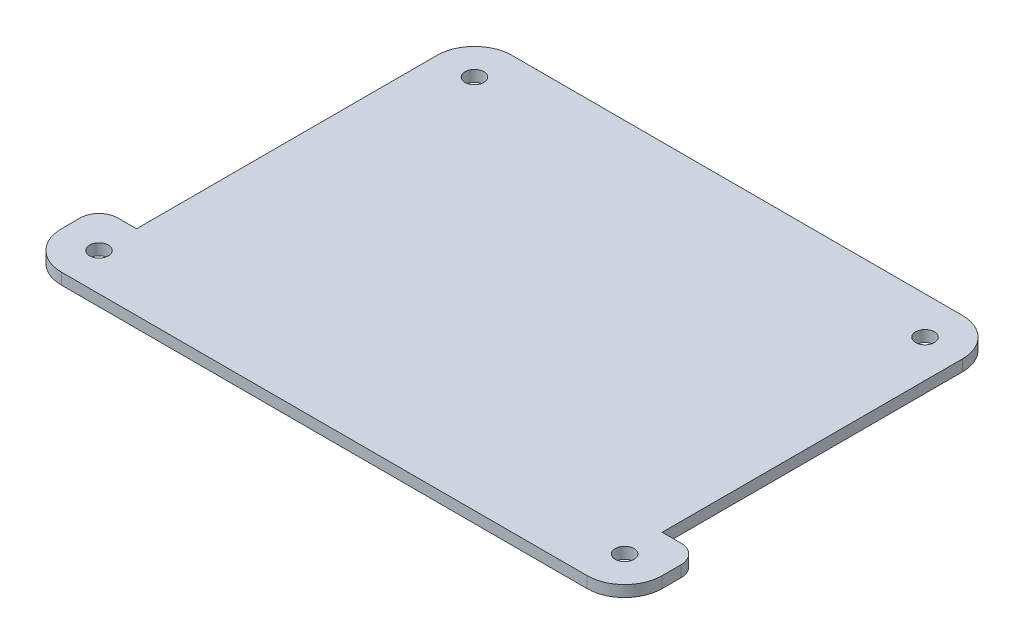
ISO-10303-21;
HEADER;
FILE_DESCRIPTION(('STEP AP214'),'2;1');
FILE_NAME('part.step','',(''),(''),'','','');
FILE_SCHEMA(('AUTOMOTIVE_DESIGN { 1 0 10303 214 1 1 1 1 }'));
ENDSEC;
DATA;
#1=APPLICATION_CONTEXT('core data for automotive mechanical design processes');
#2=APPLICATION_PROTOCOL_DEFINITION('international standard','automotive_design',2000,#1);
#3=PRODUCT_CONTEXT('',#1,'mechanical');
#4=PRODUCT('Part','Part','',(#3));
#5=PRODUCT_RELATED_PRODUCT_CATEGORY('part','',(#4));
#6=PRODUCT_DEFINITION_FORMATION('','',#4);
#7=PRODUCT_DEFINITION_CONTEXT('part definition',#1,'design');
#8=PRODUCT_DEFINITION('design','',#6,#7);
#9=PRODUCT_DEFINITION_SHAPE('','',#8);
#10=(LENGTH_UNIT() NAMED_UNIT(*) SI_UNIT(.MILLI.,.METRE.));
#11=(NAMED_UNIT(*) PLANE_ANGLE_UNIT() SI_UNIT($,.RADIAN.));
#12=(NAMED_UNIT(*) SI_UNIT($,.STERADIAN.) SOLID_ANGLE_UNIT());
#13=UNCERTAINTY_MEASURE_WITH_UNIT(LENGTH_MEASURE(1.E-05),#10,'distance_accuracy_value','');
#14=(GEOMETRIC_REPRESENTATION_CONTEXT(3) GLOBAL_UNCERTAINTY_ASSIGNED_CONTEXT((#13)) GLOBAL_UNIT_ASSIGNED_CONTEXT((#10,
#11,#12)) REPRESENTATION_CONTEXT('',''));
#15=CARTESIAN_POINT('',(0.,0.,0.));
#16=DIRECTION('',(0.,0.,1.));
#17=DIRECTION('',(1.,0.,0.));
#18=AXIS2_PLACEMENT_3D('',#15,#16,#17);
#19=CARTESIAN_POINT('',(-60.,3.,-45.));
#20=DIRECTION('',(0.,-1.,0.));
#21=DIRECTION('',(0.,0.,-1.));
#22=AXIS2_PLACEMENT_3D('',#19,#20,#21);
#23=PLANE('',#22);
#24=CARTESIAN_POINT('',(-60.,3.,-45.));
#25=DIRECTION('',(0.,1.,0.));
#26=DIRECTION('',(0.,0.,-1.));
#27=AXIS2_PLACEMENT_3D('',#24,#25,#26);
#28=CIRCLE('',#27,10.);
#29=CARTESIAN_POINT('',(-59.9999999999999,3.,-55.));
#30=VERTEX_POINT('',#29);
#31=CARTESIAN_POINT('',(-70.,3.,-44.9999999999999));
#32=VERTEX_POINT('',#31);
#33=EDGE_CURVE('E222',#30,#32,#28,.T.);
#34=ORIENTED_EDGE('',*,*,#33,.T.);
#35=DIRECTION('',(0.,0.,1.));
#36=VECTOR('',#35,1.);
#37=CARTESIAN_POINT('',(-70.,3.,-44.9999999999999));
#38=LINE('',#37,#36);
#39=CARTESIAN_POINT('',(-70.,3.,35.));
#40=VERTEX_POINT('',#39);
#41=EDGE_CURVE('E122',#32,#40,#38,.T.);
#42=ORIENTED_EDGE('',*,*,#41,.T.);
#43=DIRECTION('',(-1.,0.,0.));
#44=VECTOR('',#43,1.);
#45=CARTESIAN_POINT('',(-70.,3.,35.));
#46=LINE('',#45,#44);
#47=CARTESIAN_POINT('',(-75.,3.,35.));
#48=VERTEX_POINT('',#47);
#49=EDGE_CURVE('E267',#40,#48,#46,.T.);
#50=ORIENTED_EDGE('',*,*,#49,.T.);
#51=CARTESIAN_POINT('',(-75.,3.,40.));
#52=DIRECTION('',(0.,1.,0.));
#53=DIRECTION('',(0.,0.,1.));
#54=AXIS2_PLACEMENT_3D('',#51,#52,#53);
#55=CIRCLE('',#54,5.);
#56=CARTESIAN_POINT('',(-80.,3.,40.));
#57=VERTEX_POINT('',#56);
#58=EDGE_CURVE('E287',#48,#57,#55,.T.);
#59=ORIENTED_EDGE('',*,*,#58,.T.);
#60=DIRECTION('',(0.,0.,1.));
#61=VECTOR('',#60,1.);
#62=CARTESIAN_POINT('',(-80.,3.,40.));
#63=LINE('',#62,#61);
#64=CARTESIAN_POINT('',(-80.,3.,44.9999999999999));
#65=VERTEX_POINT('',#64);
#66=EDGE_CURVE('E283',#57,#65,#63,.T.);
#67=ORIENTED_EDGE('',*,*,#66,.T.);
#68=CARTESIAN_POINT('',(-70.,3.,45.));
#69=DIRECTION('',(0.,1.,0.));
#70=DIRECTION('',(0.,0.,-1.));
#71=AXIS2_PLACEMENT_3D('',#68,#69,#70);
#72=CIRCLE('',#71,9.99999999999999);
#73=CARTESIAN_POINT('',(-69.9999999999999,3.,55.));
#74=VERTEX_POINT('',#73);
#75=EDGE_CURVE('E286',#65,#74,#72,.T.);
#76=ORIENTED_EDGE('',*,*,#75,.T.);
#77=DIRECTION('',(1.,0.,0.));
#78=VECTOR('',#77,1.);
#79=CARTESIAN_POINT('',(-69.9999999999999,3.,55.));
#80=LINE('',#79,#78);
#81=CARTESIAN_POINT('',(69.9999999999999,3.,55.));
#82=VERTEX_POINT('',#81);
#83=EDGE_CURVE('E291',#74,#82,#80,.T.);
#84=ORIENTED_EDGE('',*,*,#83,.T.);
#85=CARTESIAN_POINT('',(70.,3.,45.));
#86=DIRECTION('',(0.,1.,0.));
#87=DIRECTION('',(0.,0.,-1.));
#88=AXIS2_PLACEMENT_3D('',#85,#86,#87);
#89=CIRCLE('',#88,9.99999999999999);
#90=CARTESIAN_POINT('',(80.,3.,44.9999999999999));
#91=VERTEX_POINT('',#90);
#92=EDGE_CURVE('E298',#82,#91,#89,.T.);
#93=ORIENTED_EDGE('',*,*,#92,.T.);
#94=DIRECTION('',(0.,0.,-1.));
#95=VECTOR('',#94,1.);
#96=CARTESIAN_POINT('',(80.,3.,40.));
#97=LINE('',#96,#95);
#98=CARTESIAN_POINT('',(80.,3.,40.));
#99=VERTEX_POINT('',#98);
#100=EDGE_CURVE('E301',#91,#99,#97,.T.);
#101=ORIENTED_EDGE('',*,*,#100,.T.);
#102=CARTESIAN_POINT('',(75.,3.,40.));
#103=DIRECTION('',(0.,1.,0.));
#104=DIRECTION('',(0.,0.,-1.));
#105=AXIS2_PLACEMENT_3D('',#102,#103,#104);
#106=CIRCLE('',#105,5.);
#107=CARTESIAN_POINT('',(75.,3.,35.));
#108=VERTEX_POINT('',#107);
#109=EDGE_CURVE('E304',#99,#108,#106,.T.);
#110=ORIENTED_EDGE('',*,*,#109,.T.);
#111=DIRECTION('',(-1.,0.,0.));
#112=VECTOR('',#111,1.);
#113=CARTESIAN_POINT('',(70.,3.,35.));
#114=LINE('',#113,#112);
#115=CARTESIAN_POINT('',(70.,3.,35.));
#116=VERTEX_POINT('',#115);
#117=EDGE_CURVE('E159',#108,#116,#114,.T.);
#118=ORIENTED_EDGE('',*,*,#117,.T.);
#119=DIRECTION('',(0.,0.,-1.));
#120=VECTOR('',#119,1.);
#121=CARTESIAN_POINT('',(70.0000000000001,3.,-44.9999999999999));
#122=LINE('',#121,#120);
#123=CARTESIAN_POINT('',(70.0000000000001,3.,-44.9999999999999));
#124=VERTEX_POINT('',#123);
#125=EDGE_CURVE('E153',#116,#124,#122,.T.);
#126=ORIENTED_EDGE('',*,*,#125,.T.);
#127=CARTESIAN_POINT('',(60.0000000000001,3.,-45.));
#128=DIRECTION('',(0.,1.,0.));
#129=DIRECTION('',(0.,0.,1.));
#130=AXIS2_PLACEMENT_3D('',#127,#128,#129);
#131=CIRCLE('',#130,10.);
#132=CARTESIAN_POINT('',(60.,3.,-55.));
#133=VERTEX_POINT('',#132);
#134=EDGE_CURVE('E157',#124,#133,#131,.T.);
#135=ORIENTED_EDGE('',*,*,#134,.T.);
#136=DIRECTION('',(-1.,0.,0.));
#137=VECTOR('',#136,1.);
#138=CARTESIAN_POINT('',(-59.9999999999999,3.,-55.));
#139=LINE('',#138,#137);
#140=EDGE_CURVE('E61',#133,#30,#139,.T.);
#141=ORIENTED_EDGE('',*,*,#140,.T.);
#142=EDGE_LOOP('',(#34,#42,#50,#59,#67,#76,#84,#93,#101,#110,#118,#126,#135,#141));
#143=FACE_BOUND('',#142,.T.);
#144=CARTESIAN_POINT('',(-60.,3.,-45.));
#145=DIRECTION('',(0.,1.,0.));
#146=DIRECTION('',(0.,0.,1.));
#147=AXIS2_PLACEMENT_3D('',#144,#145,#146);
#148=CIRCLE('',#147,2.5);
#149=CARTESIAN_POINT('',(-60.,3.,-42.5));
#150=VERTEX_POINT('',#149);
#151=EDGE_CURVE('E186',#150,#150,#148,.T.);
#152=ORIENTED_EDGE('',*,*,#151,.F.);
#153=EDGE_LOOP('',(#152));
#154=FACE_BOUND('',#153,.T.);
#155=CARTESIAN_POINT('',(60.,3.,-45.));
#156=DIRECTION('',(0.,1.,0.));
#157=DIRECTION('',(0.,0.,1.));
#158=AXIS2_PLACEMENT_3D('',#155,#156,#157);
#159=CIRCLE('',#158,2.5);
#160=CARTESIAN_POINT('',(60.,3.,-42.5));
#161=VERTEX_POINT('',#160);
#162=EDGE_CURVE('E374',#161,#161,#159,.T.);
#163=ORIENTED_EDGE('',*,*,#162,.F.);
#164=EDGE_LOOP('',(#163));
#165=FACE_BOUND('',#164,.T.);
#166=CARTESIAN_POINT('',(-70.,3.,45.));
#167=DIRECTION('',(0.,1.,0.));
#168=DIRECTION('',(0.,0.,1.));
#169=AXIS2_PLACEMENT_3D('',#166,#167,#168);
#170=CIRCLE('',#169,2.50000000000001);
#171=CARTESIAN_POINT('',(-70.,3.,47.5));
#172=VERTEX_POINT('',#171);
#173=EDGE_CURVE('E366',#172,#172,#170,.T.);
#174=ORIENTED_EDGE('',*,*,#173,.F.);
#175=EDGE_LOOP('',(#174));
#176=FACE_BOUND('',#175,.T.);
#177=CARTESIAN_POINT('',(70.,3.,45.));
#178=DIRECTION('',(0.,1.,0.));
#179=DIRECTION('',(0.,0.,1.));
#180=AXIS2_PLACEMENT_3D('',#177,#178,#179);
#181=CIRCLE('',#180,2.50000000000001);
#182=CARTESIAN_POINT('',(70.,3.,47.5));
#183=VERTEX_POINT('',#182);
#184=EDGE_CURVE('E355',#183,#183,#181,.T.);
#185=ORIENTED_EDGE('',*,*,#184,.F.);
#186=EDGE_LOOP('',(#185));
#187=FACE_BOUND('',#186,.T.);
#188=ADVANCED_FACE('F43',(#143,#154,#165,#176,#187),#23,.F.);
#189=CARTESIAN_POINT('',(-60.,0.,-45.));
#190=DIRECTION('',(0.,-1.,0.));
#191=DIRECTION('',(0.,0.,-1.));
#192=AXIS2_PLACEMENT_3D('',#189,#190,#191);
#193=PLANE('',#192);
#194=CARTESIAN_POINT('',(-70.,0.,45.));
#195=DIRECTION('',(0.,1.,0.));
#196=DIRECTION('',(0.,0.,1.));
#197=AXIS2_PLACEMENT_3D('',#194,#195,#196);
#198=CIRCLE('',#197,2.50000000000001);
#199=CARTESIAN_POINT('',(-70.,0.,47.5));
#200=VERTEX_POINT('',#199);
#201=EDGE_CURVE('E363',#200,#200,#198,.T.);
#202=ORIENTED_EDGE('',*,*,#201,.T.);
#203=EDGE_LOOP('',(#202));
#204=FACE_BOUND('',#203,.T.);
#205=CARTESIAN_POINT('',(-60.,0.,-45.));
#206=DIRECTION('',(0.,1.,0.));
#207=DIRECTION('',(0.,0.,1.));
#208=AXIS2_PLACEMENT_3D('',#205,#206,#207);
#209=CIRCLE('',#208,2.5);
#210=CARTESIAN_POINT('',(-60.,0.,-42.5));
#211=VERTEX_POINT('',#210);
#212=EDGE_CURVE('E378',#211,#211,#209,.T.);
#213=ORIENTED_EDGE('',*,*,#212,.T.);
#214=EDGE_LOOP('',(#213));
#215=FACE_BOUND('',#214,.T.);
#216=CARTESIAN_POINT('',(-60.,0.,-45.));
#217=DIRECTION('',(0.,1.,0.));
#218=DIRECTION('',(0.,0.,-1.));
#219=AXIS2_PLACEMENT_3D('',#216,#217,#218);
#220=CIRCLE('',#219,10.);
#221=CARTESIAN_POINT('',(-59.9999999999999,0.,-55.));
#222=VERTEX_POINT('',#221);
#223=CARTESIAN_POINT('',(-70.,0.,-44.9999999999999));
#224=VERTEX_POINT('',#223);
#225=EDGE_CURVE('E181',#222,#224,#220,.T.);
#226=ORIENTED_EDGE('',*,*,#225,.F.);
#227=DIRECTION('',(-1.,0.,0.));
#228=VECTOR('',#227,1.);
#229=CARTESIAN_POINT('',(-59.9999999999999,0.,-55.));
#230=LINE('',#229,#228);
#231=CARTESIAN_POINT('',(60.,0.,-55.));
#232=VERTEX_POINT('',#231);
#233=EDGE_CURVE('E114',#232,#222,#230,.T.);
#234=ORIENTED_EDGE('',*,*,#233,.F.);
#235=CARTESIAN_POINT('',(60.0000000000001,0.,-45.));
#236=DIRECTION('',(0.,1.,0.));
#237=DIRECTION('',(0.,0.,1.));
#238=AXIS2_PLACEMENT_3D('',#235,#236,#237);
#239=CIRCLE('',#238,10.);
#240=CARTESIAN_POINT('',(70.0000000000001,0.,-44.9999999999999));
#241=VERTEX_POINT('',#240);
#242=EDGE_CURVE('E108',#241,#232,#239,.T.);
#243=ORIENTED_EDGE('',*,*,#242,.F.);
#244=DIRECTION('',(0.,0.,-1.));
#245=VECTOR('',#244,1.);
#246=CARTESIAN_POINT('',(70.0000000000001,0.,-44.9999999999999));
#247=LINE('',#246,#245);
#248=CARTESIAN_POINT('',(70.,0.,35.));
#249=VERTEX_POINT('',#248);
#250=EDGE_CURVE('E168',#249,#241,#247,.T.);
#251=ORIENTED_EDGE('',*,*,#250,.F.);
#252=DIRECTION('',(-1.,0.,0.));
#253=VECTOR('',#252,1.);
#254=CARTESIAN_POINT('',(70.,0.,35.));
#255=LINE('',#254,#253);
#256=CARTESIAN_POINT('',(75.,0.,35.));
#257=VERTEX_POINT('',#256);
#258=EDGE_CURVE('E213',#257,#249,#255,.T.);
#259=ORIENTED_EDGE('',*,*,#258,.F.);
#260=CARTESIAN_POINT('',(75.,0.,40.));
#261=DIRECTION('',(0.,1.,0.));
#262=DIRECTION('',(0.,0.,-1.));
#263=AXIS2_PLACEMENT_3D('',#260,#261,#262);
#264=CIRCLE('',#263,5.);
#265=CARTESIAN_POINT('',(80.,0.,40.));
#266=VERTEX_POINT('',#265);
#267=EDGE_CURVE('E210',#266,#257,#264,.T.);
#268=ORIENTED_EDGE('',*,*,#267,.F.);
#269=DIRECTION('',(0.,0.,-1.));
#270=VECTOR('',#269,1.);
#271=CARTESIAN_POINT('',(80.,0.,40.));
#272=LINE('',#271,#270);
#273=CARTESIAN_POINT('',(80.,0.,44.9999999999999));
#274=VERTEX_POINT('',#273);
#275=EDGE_CURVE('E207',#274,#266,#272,.T.);
#276=ORIENTED_EDGE('',*,*,#275,.F.);
#277=CARTESIAN_POINT('',(70.,0.,45.));
#278=DIRECTION('',(0.,1.,0.));
#279=DIRECTION('',(0.,0.,-1.));
#280=AXIS2_PLACEMENT_3D('',#277,#278,#279);
#281=CIRCLE('',#280,9.99999999999999);
#282=CARTESIAN_POINT('',(69.9999999999999,0.,55.));
#283=VERTEX_POINT('',#282);
#284=EDGE_CURVE('E204',#283,#274,#281,.T.);
#285=ORIENTED_EDGE('',*,*,#284,.F.);
#286=DIRECTION('',(1.,0.,0.));
#287=VECTOR('',#286,1.);
#288=CARTESIAN_POINT('',(-69.9999999999999,0.,55.));
#289=LINE('',#288,#287);
#290=CARTESIAN_POINT('',(-69.9999999999999,0.,55.));
#291=VERTEX_POINT('',#290);
#292=EDGE_CURVE('E201',#291,#283,#289,.T.);
#293=ORIENTED_EDGE('',*,*,#292,.F.);
#294=CARTESIAN_POINT('',(-70.,0.,45.));
#295=DIRECTION('',(0.,1.,0.));
#296=DIRECTION('',(0.,0.,-1.));
#297=AXIS2_PLACEMENT_3D('',#294,#295,#296);
#298=CIRCLE('',#297,9.99999999999999);
#299=CARTESIAN_POINT('',(-80.,0.,44.9999999999999));
#300=VERTEX_POINT('',#299);
#301=EDGE_CURVE('E198',#300,#291,#298,.T.);
#302=ORIENTED_EDGE('',*,*,#301,.F.);
#303=DIRECTION('',(0.,0.,1.));
#304=VECTOR('',#303,1.);
#305=CARTESIAN_POINT('',(-80.,0.,40.));
#306=LINE('',#305,#304);
#307=CARTESIAN_POINT('',(-80.,0.,40.));
#308=VERTEX_POINT('',#307);
#309=EDGE_CURVE('E195',#308,#300,#306,.T.);
#310=ORIENTED_EDGE('',*,*,#309,.F.);
#311=CARTESIAN_POINT('',(-75.,0.,40.));
#312=DIRECTION('',(0.,1.,0.));
#313=DIRECTION('',(0.,0.,1.));
#314=AXIS2_PLACEMENT_3D('',#311,#312,#313);
#315=CIRCLE('',#314,5.);
#316=CARTESIAN_POINT('',(-75.,0.,35.));
#317=VERTEX_POINT('',#316);
#318=EDGE_CURVE('E192',#317,#308,#315,.T.);
#319=ORIENTED_EDGE('',*,*,#318,.F.);
#320=DIRECTION('',(-1.,0.,0.));
#321=VECTOR('',#320,1.);
#322=CARTESIAN_POINT('',(-70.,0.,35.));
#323=LINE('',#322,#321);
#324=CARTESIAN_POINT('',(-70.,0.,35.));
#325=VERTEX_POINT('',#324);
#326=EDGE_CURVE('E189',#325,#317,#323,.T.);
#327=ORIENTED_EDGE('',*,*,#326,.F.);
#328=DIRECTION('',(0.,0.,1.));
#329=VECTOR('',#328,1.);
#330=CARTESIAN_POINT('',(-70.,0.,-44.9999999999999));
#331=LINE('',#330,#329);
#332=EDGE_CURVE('E185',#224,#325,#331,.T.);
#333=ORIENTED_EDGE('',*,*,#332,.F.);
#334=EDGE_LOOP('',(#226,#234,#243,#251,#259,#268,#276,#285,#293,#302,#310,#319,#327,#333));
#335=FACE_BOUND('',#334,.T.);
#336=CARTESIAN_POINT('',(60.,0.,-45.));
#337=DIRECTION('',(0.,1.,0.));
#338=DIRECTION('',(0.,0.,1.));
#339=AXIS2_PLACEMENT_3D('',#336,#337,#338);
#340=CIRCLE('',#339,2.5);
#341=CARTESIAN_POINT('',(60.,0.,-42.5));
#342=VERTEX_POINT('',#341);
#343=EDGE_CURVE('E370',#342,#342,#340,.T.);
#344=ORIENTED_EDGE('',*,*,#343,.T.);
#345=EDGE_LOOP('',(#344));
#346=FACE_BOUND('',#345,.T.);
#347=CARTESIAN_POINT('',(70.,0.,45.));
#348=DIRECTION('',(0.,1.,0.));
#349=DIRECTION('',(0.,0.,1.));
#350=AXIS2_PLACEMENT_3D('',#347,#348,#349);
#351=CIRCLE('',#350,2.50000000000001);
#352=CARTESIAN_POINT('',(70.,0.,47.5));
#353=VERTEX_POINT('',#352);
#354=EDGE_CURVE('E358',#353,#353,#351,.T.);
#355=ORIENTED_EDGE('',*,*,#354,.T.);
#356=EDGE_LOOP('',(#355));
#357=FACE_BOUND('',#356,.T.);
#358=ADVANCED_FACE('F271',(#204,#215,#335,#346,#357),#193,.T.);
#359=CARTESIAN_POINT('',(-60.,3.,-45.));
#360=DIRECTION('',(0.,-1.,0.));
#361=DIRECTION('',(0.,0.,-1.));
#362=AXIS2_PLACEMENT_3D('',#359,#360,#361);
#363=CYLINDRICAL_SURFACE('',#362,10.);
#364=ORIENTED_EDGE('',*,*,#225,.T.);
#365=DIRECTION('',(0.,-1.,0.));
#366=VECTOR('',#365,1.);
#367=CARTESIAN_POINT('',(-70.,3.,-44.9999999999999));
#368=LINE('',#367,#366);
#369=EDGE_CURVE('E11',#32,#224,#368,.T.);
#370=ORIENTED_EDGE('',*,*,#369,.F.);
#371=ORIENTED_EDGE('',*,*,#33,.F.);
#372=DIRECTION('',(0.,-1.,0.));
#373=VECTOR('',#372,1.);
#374=CARTESIAN_POINT('',(-59.9999999999999,3.,-55.));
#375=LINE('',#374,#373);
#376=EDGE_CURVE('E177',#30,#222,#375,.T.);
#377=ORIENTED_EDGE('',*,*,#376,.T.);
#378=EDGE_LOOP('',(#364,#370,#371,#377));
#379=FACE_BOUND('',#378,.T.);
#380=ADVANCED_FACE('F45',(#379),#363,.T.);
#381=CARTESIAN_POINT('',(-70.,3.,-44.9999999999999));
#382=DIRECTION('',(1.,0.,0.));
#383=DIRECTION('',(0.,0.,-1.));
#384=AXIS2_PLACEMENT_3D('',#381,#382,#383);
#385=PLANE('',#384);
#386=ORIENTED_EDGE('',*,*,#332,.T.);
#387=DIRECTION('',(0.,-1.,0.));
#388=VECTOR('',#387,1.);
#389=CARTESIAN_POINT('',(-70.,3.,35.));
#390=LINE('',#389,#388);
#391=EDGE_CURVE('E53',#40,#325,#390,.T.);
#392=ORIENTED_EDGE('',*,*,#391,.F.);
#393=ORIENTED_EDGE('',*,*,#41,.F.);
#394=ORIENTED_EDGE('',*,*,#369,.T.);
#395=EDGE_LOOP('',(#386,#392,#393,#394));
#396=FACE_BOUND('',#395,.T.);
#397=ADVANCED_FACE('F528',(#396),#385,.F.);
#398=CARTESIAN_POINT('',(-70.,3.,35.));
#399=DIRECTION('',(0.,0.,1.));
#400=DIRECTION('',(1.,0.,0.));
#401=AXIS2_PLACEMENT_3D('',#398,#399,#400);
#402=PLANE('',#401);
#403=ORIENTED_EDGE('',*,*,#326,.T.);
#404=DIRECTION('',(0.,-1.,0.));
#405=VECTOR('',#404,1.);
#406=CARTESIAN_POINT('',(-75.,3.,35.));
#407=LINE('',#406,#405);
#408=EDGE_CURVE('E257',#48,#317,#407,.T.);
#409=ORIENTED_EDGE('',*,*,#408,.F.);
#410=ORIENTED_EDGE('',*,*,#49,.F.);
#411=ORIENTED_EDGE('',*,*,#391,.T.);
#412=EDGE_LOOP('',(#403,#409,#410,#411));
#413=FACE_BOUND('',#412,.T.);
#414=ADVANCED_FACE('F265',(#413),#402,.F.);
#415=CARTESIAN_POINT('',(-75.,3.,40.));
#416=DIRECTION('',(0.,-1.,0.));
#417=DIRECTION('',(0.,0.,-1.));
#418=AXIS2_PLACEMENT_3D('',#415,#416,#417);
#419=CYLINDRICAL_SURFACE('',#418,5.);
#420=ORIENTED_EDGE('',*,*,#318,.T.);
#421=DIRECTION('',(0.,-1.,0.));
#422=VECTOR('',#421,1.);
#423=CARTESIAN_POINT('',(-80.,3.,40.));
#424=LINE('',#423,#422);
#425=EDGE_CURVE('E253',#57,#308,#424,.T.);
#426=ORIENTED_EDGE('',*,*,#425,.F.);
#427=ORIENTED_EDGE('',*,*,#58,.F.);
#428=ORIENTED_EDGE('',*,*,#408,.T.);
#429=EDGE_LOOP('',(#420,#426,#427,#428));
#430=FACE_BOUND('',#429,.T.);
#431=ADVANCED_FACE('F277',(#430),#419,.T.);
#432=CARTESIAN_POINT('',(-80.,3.,40.));
#433=DIRECTION('',(1.,0.,0.));
#434=DIRECTION('',(0.,0.,-1.));
#435=AXIS2_PLACEMENT_3D('',#432,#433,#434);
#436=PLANE('',#435);
#437=ORIENTED_EDGE('',*,*,#309,.T.);
#438=DIRECTION('',(0.,-1.,0.));
#439=VECTOR('',#438,1.);
#440=CARTESIAN_POINT('',(-80.,3.,44.9999999999999));
#441=LINE('',#440,#439);
#442=EDGE_CURVE('E249',#65,#300,#441,.T.);
#443=ORIENTED_EDGE('',*,*,#442,.F.);
#444=ORIENTED_EDGE('',*,*,#66,.F.);
#445=ORIENTED_EDGE('',*,*,#425,.T.);
#446=EDGE_LOOP('',(#437,#443,#444,#445));
#447=FACE_BOUND('',#446,.T.);
#448=ADVANCED_FACE('F281',(#447),#436,.F.);
#449=CARTESIAN_POINT('',(-70.,3.,45.));
#450=DIRECTION('',(0.,-1.,0.));
#451=DIRECTION('',(0.,0.,-1.));
#452=AXIS2_PLACEMENT_3D('',#449,#450,#451);
#453=CYLINDRICAL_SURFACE('',#452,9.99999999999999);
#454=ORIENTED_EDGE('',*,*,#301,.T.);
#455=DIRECTION('',(0.,-1.,0.));
#456=VECTOR('',#455,1.);
#457=CARTESIAN_POINT('',(-69.9999999999999,3.,55.));
#458=LINE('',#457,#456);
#459=EDGE_CURVE('E245',#74,#291,#458,.T.);
#460=ORIENTED_EDGE('',*,*,#459,.F.);
#461=ORIENTED_EDGE('',*,*,#75,.F.);
#462=ORIENTED_EDGE('',*,*,#442,.T.);
#463=EDGE_LOOP('',(#454,#460,#461,#462));
#464=FACE_BOUND('',#463,.T.);
#465=ADVANCED_FACE('F489',(#464),#453,.T.);
#466=CARTESIAN_POINT('',(-69.9999999999999,3.,55.));
#467=DIRECTION('',(0.,0.,-1.));
#468=DIRECTION('',(-1.,0.,0.));
#469=AXIS2_PLACEMENT_3D('',#466,#467,#468);
#470=PLANE('',#469);
#471=ORIENTED_EDGE('',*,*,#292,.T.);
#472=DIRECTION('',(0.,-1.,0.));
#473=VECTOR('',#472,1.);
#474=CARTESIAN_POINT('',(69.9999999999999,3.,55.));
#475=LINE('',#474,#473);
#476=EDGE_CURVE('E241',#82,#283,#475,.T.);
#477=ORIENTED_EDGE('',*,*,#476,.F.);
#478=ORIENTED_EDGE('',*,*,#83,.F.);
#479=ORIENTED_EDGE('',*,*,#459,.T.);
#480=EDGE_LOOP('',(#471,#477,#478,#479));
#481=FACE_BOUND('',#480,.T.);
#482=ADVANCED_FACE('F478',(#481),#470,.F.);
#483=CARTESIAN_POINT('',(70.,3.,45.));
#484=DIRECTION('',(0.,-1.,0.));
#485=DIRECTION('',(0.,0.,-1.));
#486=AXIS2_PLACEMENT_3D('',#483,#484,#485);
#487=CYLINDRICAL_SURFACE('',#486,9.99999999999999);
#488=ORIENTED_EDGE('',*,*,#284,.T.);
#489=DIRECTION('',(0.,-1.,0.));
#490=VECTOR('',#489,1.);
#491=CARTESIAN_POINT('',(80.,3.,44.9999999999999));
#492=LINE('',#491,#490);
#493=EDGE_CURVE('E237',#91,#274,#492,.T.);
#494=ORIENTED_EDGE('',*,*,#493,.F.);
#495=ORIENTED_EDGE('',*,*,#92,.F.);
#496=ORIENTED_EDGE('',*,*,#476,.T.);
#497=EDGE_LOOP('',(#488,#494,#495,#496));
#498=FACE_BOUND('',#497,.T.);
#499=ADVANCED_FACE('F467',(#498),#487,.T.);
#500=CARTESIAN_POINT('',(80.,3.,40.));
#501=DIRECTION('',(-1.,0.,0.));
#502=DIRECTION('',(0.,0.,1.));
#503=AXIS2_PLACEMENT_3D('',#500,#501,#502);
#504=PLANE('',#503);
#505=ORIENTED_EDGE('',*,*,#275,.T.);
#506=DIRECTION('',(0.,-1.,0.));
#507=VECTOR('',#506,1.);
#508=CARTESIAN_POINT('',(80.,3.,40.));
#509=LINE('',#508,#507);
#510=EDGE_CURVE('E233',#99,#266,#509,.T.);
#511=ORIENTED_EDGE('',*,*,#510,.F.);
#512=ORIENTED_EDGE('',*,*,#100,.F.);
#513=ORIENTED_EDGE('',*,*,#493,.T.);
#514=EDGE_LOOP('',(#505,#511,#512,#513));
#515=FACE_BOUND('',#514,.T.);
#516=ADVANCED_FACE('F457',(#515),#504,.F.);
#517=CARTESIAN_POINT('',(75.,3.,40.));
#518=DIRECTION('',(0.,-1.,0.));
#519=DIRECTION('',(0.,0.,-1.));
#520=AXIS2_PLACEMENT_3D('',#517,#518,#519);
#521=CYLINDRICAL_SURFACE('',#520,5.);
#522=ORIENTED_EDGE('',*,*,#267,.T.);
#523=DIRECTION('',(0.,-1.,0.));
#524=VECTOR('',#523,1.);
#525=CARTESIAN_POINT('',(75.,3.,35.));
#526=LINE('',#525,#524);
#527=EDGE_CURVE('E229',#108,#257,#526,.T.);
#528=ORIENTED_EDGE('',*,*,#527,.F.);
#529=ORIENTED_EDGE('',*,*,#109,.F.);
#530=ORIENTED_EDGE('',*,*,#510,.T.);
#531=EDGE_LOOP('',(#522,#528,#529,#530));
#532=FACE_BOUND('',#531,.T.);
#533=ADVANCED_FACE('F312',(#532),#521,.T.);
#534=CARTESIAN_POINT('',(70.,3.,35.));
#535=DIRECTION('',(0.,0.,1.));
#536=DIRECTION('',(1.,0.,0.));
#537=AXIS2_PLACEMENT_3D('',#534,#535,#536);
#538=PLANE('',#537);
#539=ORIENTED_EDGE('',*,*,#258,.T.);
#540=DIRECTION('',(0.,-1.,0.));
#541=VECTOR('',#540,1.);
#542=CARTESIAN_POINT('',(70.,3.,35.));
#543=LINE('',#542,#541);
#544=EDGE_CURVE('E170',#116,#249,#543,.T.);
#545=ORIENTED_EDGE('',*,*,#544,.F.);
#546=ORIENTED_EDGE('',*,*,#117,.F.);
#547=ORIENTED_EDGE('',*,*,#527,.T.);
#548=EDGE_LOOP('',(#539,#545,#546,#547));
#549=FACE_BOUND('',#548,.T.);
#550=ADVANCED_FACE('F316',(#549),#538,.F.);
#551=CARTESIAN_POINT('',(70.0000000000001,3.,-44.9999999999999));
#552=DIRECTION('',(-1.,0.,0.));
#553=DIRECTION('',(0.,0.,1.));
#554=AXIS2_PLACEMENT_3D('',#551,#552,#553);
#555=PLANE('',#554);
#556=ORIENTED_EDGE('',*,*,#250,.T.);
#557=DIRECTION('',(0.,-1.,0.));
#558=VECTOR('',#557,1.);
#559=CARTESIAN_POINT('',(70.0000000000001,3.,-44.9999999999999));
#560=LINE('',#559,#558);
#561=EDGE_CURVE('E165',#124,#241,#560,.T.);
#562=ORIENTED_EDGE('',*,*,#561,.F.);
#563=ORIENTED_EDGE('',*,*,#125,.F.);
#564=ORIENTED_EDGE('',*,*,#544,.T.);
#565=EDGE_LOOP('',(#556,#562,#563,#564));
#566=FACE_BOUND('',#565,.T.);
#567=ADVANCED_FACE('F166',(#566),#555,.F.);
#568=CARTESIAN_POINT('',(60.0000000000001,3.,-45.));
#569=DIRECTION('',(0.,-1.,0.));
#570=DIRECTION('',(0.,0.,-1.));
#571=AXIS2_PLACEMENT_3D('',#568,#569,#570);
#572=CYLINDRICAL_SURFACE('',#571,10.);
#573=ORIENTED_EDGE('',*,*,#242,.T.);
#574=DIRECTION('',(0.,-1.,0.));
#575=VECTOR('',#574,1.);
#576=CARTESIAN_POINT('',(60.,3.,-55.));
#577=LINE('',#576,#575);
#578=EDGE_CURVE('E171',#133,#232,#577,.T.);
#579=ORIENTED_EDGE('',*,*,#578,.F.);
#580=ORIENTED_EDGE('',*,*,#134,.F.);
#581=ORIENTED_EDGE('',*,*,#561,.T.);
#582=EDGE_LOOP('',(#573,#579,#580,#581));
#583=FACE_BOUND('',#582,.T.);
#584=ADVANCED_FACE('F173',(#583),#572,.T.);
#585=CARTESIAN_POINT('',(-59.9999999999999,3.,-55.));
#586=DIRECTION('',(0.,0.,1.));
#587=DIRECTION('',(1.,0.,0.));
#588=AXIS2_PLACEMENT_3D('',#585,#586,#587);
#589=PLANE('',#588);
#590=ORIENTED_EDGE('',*,*,#233,.T.);
#591=ORIENTED_EDGE('',*,*,#376,.F.);
#592=ORIENTED_EDGE('',*,*,#140,.F.);
#593=ORIENTED_EDGE('',*,*,#578,.T.);
#594=EDGE_LOOP('',(#590,#591,#592,#593));
#595=FACE_BOUND('',#594,.T.);
#596=ADVANCED_FACE('F320',(#595),#589,.F.);
#597=CARTESIAN_POINT('',(-60.,3.,-45.));
#598=DIRECTION('',(0.,-1.,0.));
#599=DIRECTION('',(0.,0.,-1.));
#600=AXIS2_PLACEMENT_3D('',#597,#598,#599);
#601=CYLINDRICAL_SURFACE('',#600,2.5);
#602=ORIENTED_EDGE('',*,*,#151,.T.);
#603=EDGE_LOOP('',(#602));
#604=FACE_BOUND('',#603,.T.);
#605=ORIENTED_EDGE('',*,*,#212,.F.);
#606=EDGE_LOOP('',(#605));
#607=FACE_BOUND('',#606,.T.);
#608=ADVANCED_FACE('F322',(#604,#607),#601,.F.);
#609=CARTESIAN_POINT('',(60.,3.,-45.));
#610=DIRECTION('',(0.,-1.,0.));
#611=DIRECTION('',(0.,0.,-1.));
#612=AXIS2_PLACEMENT_3D('',#609,#610,#611);
#613=CYLINDRICAL_SURFACE('',#612,2.5);
#614=ORIENTED_EDGE('',*,*,#162,.T.);
#615=EDGE_LOOP('',(#614));
#616=FACE_BOUND('',#615,.T.);
#617=ORIENTED_EDGE('',*,*,#343,.F.);
#618=EDGE_LOOP('',(#617));
#619=FACE_BOUND('',#618,.T.);
#620=ADVANCED_FACE('F328',(#616,#619),#613,.F.);
#621=CARTESIAN_POINT('',(-70.,3.,45.));
#622=DIRECTION('',(0.,-1.,0.));
#623=DIRECTION('',(0.,0.,-1.));
#624=AXIS2_PLACEMENT_3D('',#621,#622,#623);
#625=CYLINDRICAL_SURFACE('',#624,2.50000000000001);
#626=ORIENTED_EDGE('',*,*,#173,.T.);
#627=EDGE_LOOP('',(#626));
#628=FACE_BOUND('',#627,.T.);
#629=ORIENTED_EDGE('',*,*,#201,.F.);
#630=EDGE_LOOP('',(#629));
#631=FACE_BOUND('',#630,.T.);
#632=ADVANCED_FACE('F342',(#628,#631),#625,.F.);
#633=CARTESIAN_POINT('',(70.,3.,45.));
#634=DIRECTION('',(0.,-1.,0.));
#635=DIRECTION('',(0.,0.,-1.));
#636=AXIS2_PLACEMENT_3D('',#633,#634,#635);
#637=CYLINDRICAL_SURFACE('',#636,2.50000000000001);
#638=ORIENTED_EDGE('',*,*,#184,.T.);
#639=EDGE_LOOP('',(#638));
#640=FACE_BOUND('',#639,.T.);
#641=ORIENTED_EDGE('',*,*,#354,.F.);
#642=EDGE_LOOP('',(#641));
#643=FACE_BOUND('',#642,.T.);
#644=ADVANCED_FACE('F346',(#640,#643),#637,.F.);
#645=CLOSED_SHELL('',(#188,#358,#380,#397,#414,#431,#448,#465,#482,#499,#516,#533,#550,#567,
#584,#596,#608,#620,#632,#644));
#646=MANIFOLD_SOLID_BREP('B2',#645);
#647=ADVANCED_BREP_SHAPE_REPRESENTATION('',(#18,#646),#14);
#648=SHAPE_DEFINITION_REPRESENTATION(#9,#647);
ENDSEC;
END-ISO-10303-21;
